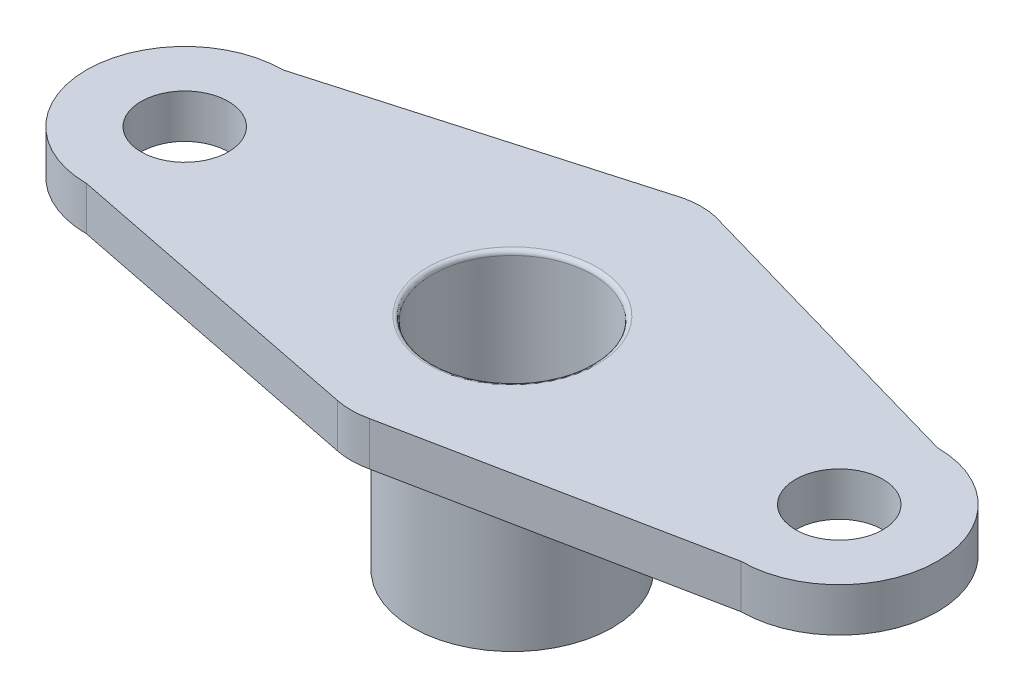
ISO-10303-21;
HEADER;
FILE_DESCRIPTION(('STEP AP214'),'2;1');
FILE_NAME('part.step','',(''),(''),'','','');
FILE_SCHEMA(('AUTOMOTIVE_DESIGN { 1 0 10303 214 1 1 1 1 }'));
ENDSEC;
DATA;
#1=APPLICATION_CONTEXT('core data for automotive mechanical design processes');
#2=APPLICATION_PROTOCOL_DEFINITION('international standard','automotive_design',2000,#1);
#3=PRODUCT_CONTEXT('',#1,'mechanical');
#4=PRODUCT('Part','Part','',(#3));
#5=PRODUCT_RELATED_PRODUCT_CATEGORY('part','',(#4));
#6=PRODUCT_DEFINITION_FORMATION('','',#4);
#7=PRODUCT_DEFINITION_CONTEXT('part definition',#1,'design');
#8=PRODUCT_DEFINITION('design','',#6,#7);
#9=PRODUCT_DEFINITION_SHAPE('','',#8);
#10=(LENGTH_UNIT() NAMED_UNIT(*) SI_UNIT(.MILLI.,.METRE.));
#11=(NAMED_UNIT(*) PLANE_ANGLE_UNIT() SI_UNIT($,.RADIAN.));
#12=(NAMED_UNIT(*) SI_UNIT($,.STERADIAN.) SOLID_ANGLE_UNIT());
#13=UNCERTAINTY_MEASURE_WITH_UNIT(LENGTH_MEASURE(1.E-05),#10,'distance_accuracy_value','');
#14=(GEOMETRIC_REPRESENTATION_CONTEXT(3) GLOBAL_UNCERTAINTY_ASSIGNED_CONTEXT((#13)) GLOBAL_UNIT_ASSIGNED_CONTEXT((#10,
#11,#12)) REPRESENTATION_CONTEXT('',''));
#15=CARTESIAN_POINT('',(0.,0.,0.));
#16=DIRECTION('',(0.,0.,1.));
#17=DIRECTION('',(1.,0.,0.));
#18=AXIS2_PLACEMENT_3D('',#15,#16,#17);
#19=CARTESIAN_POINT('',(-75.,5.,0.));
#20=DIRECTION('',(0.,1.,0.));
#21=DIRECTION('',(0.,0.,1.));
#22=AXIS2_PLACEMENT_3D('',#19,#20,#21);
#23=PLANE('',#22);
#24=CARTESIAN_POINT('',(0.,5.,0.));
#25=DIRECTION('',(0.,1.,0.));
#26=DIRECTION('',(0.,0.,1.));
#27=AXIS2_PLACEMENT_3D('',#24,#25,#26);
#28=CIRCLE('',#27,19.3437615531446);
#29=CARTESIAN_POINT('',(0.,5.,19.3437615531446));
#30=VERTEX_POINT('',#29);
#31=EDGE_CURVE('E11',#30,#30,#28,.F.);
#32=ORIENTED_EDGE('',*,*,#31,.T.);
#33=EDGE_LOOP('',(#32));
#34=FACE_BOUND('',#33,.T.);
#35=CARTESIAN_POINT('',(-75.,5.,0.));
#36=DIRECTION('',(0.,1.,0.));
#37=DIRECTION('',(0.,0.,1.));
#38=AXIS2_PLACEMENT_3D('',#35,#36,#37);
#39=CIRCLE('',#38,9.99999999999999);
#40=CARTESIAN_POINT('',(-75.,5.,9.99999999999999));
#41=VERTEX_POINT('',#40);
#42=EDGE_CURVE('E143',#41,#41,#39,.T.);
#43=ORIENTED_EDGE('',*,*,#42,.F.);
#44=EDGE_LOOP('',(#43));
#45=FACE_BOUND('',#44,.T.);
#46=CARTESIAN_POINT('',(-75.,5.,0.));
#47=DIRECTION('',(0.,1.,0.));
#48=DIRECTION('',(0.,0.,1.));
#49=AXIS2_PLACEMENT_3D('',#46,#47,#48);
#50=CIRCLE('',#49,22.5);
#51=CARTESIAN_POINT('',(-75.,5.,-22.5));
#52=VERTEX_POINT('',#51);
#53=CARTESIAN_POINT('',(-75.,5.,22.5));
#54=VERTEX_POINT('',#53);
#55=EDGE_CURVE('E155',#52,#54,#50,.T.);
#56=ORIENTED_EDGE('',*,*,#55,.T.);
#57=DIRECTION('',(0.9807029114669,0.,0.195503962722871));
#58=VECTOR('',#57,1.);
#59=CARTESIAN_POINT('',(-75.,5.,22.5));
#60=LINE('',#59,#58);
#61=CARTESIAN_POINT('',(-3.19997264006877,5.,36.8133967569045));
#62=VERTEX_POINT('',#61);
#63=EDGE_CURVE('E99',#54,#62,#60,.T.);
#64=ORIENTED_EDGE('',*,*,#63,.T.);
#65=CARTESIAN_POINT('',(0.207378380876347,5.,20.0427553689834));
#66=DIRECTION('',(0.,1.,0.));
#67=DIRECTION('',(0.,0.,1.));
#68=AXIS2_PLACEMENT_3D('',#65,#66,#67);
#69=CIRCLE('',#68,17.1132829562941);
#70=CARTESIAN_POINT('',(4.04334236130269,5.,36.7205799838143));
#71=VERTEX_POINT('',#70);
#72=EDGE_CURVE('E192',#62,#71,#69,.T.);
#73=ORIENTED_EDGE('',*,*,#72,.T.);
#74=DIRECTION('',(0.980408150528872,0.,-0.196976796543542));
#75=VECTOR('',#74,1.);
#76=CARTESIAN_POINT('',(4.04334236130269,5.,36.7205799838143));
#77=LINE('',#76,#75);
#78=CARTESIAN_POINT('',(74.8231132075472,5.,22.5));
#79=VERTEX_POINT('',#78);
#80=EDGE_CURVE('E194',#71,#79,#77,.T.);
#81=ORIENTED_EDGE('',*,*,#80,.T.);
#82=CARTESIAN_POINT('',(74.8231132075472,5.,0.));
#83=DIRECTION('',(0.,1.,0.));
#84=DIRECTION('',(0.,0.,-1.));
#85=AXIS2_PLACEMENT_3D('',#82,#83,#84);
#86=CIRCLE('',#85,22.5);
#87=CARTESIAN_POINT('',(74.8231132075472,5.,-22.5));
#88=VERTEX_POINT('',#87);
#89=EDGE_CURVE('E118',#79,#88,#86,.T.);
#90=ORIENTED_EDGE('',*,*,#89,.T.);
#91=DIRECTION('',(-0.9613987393649,0.,-0.275158979405691));
#92=VECTOR('',#91,1.);
#93=CARTESIAN_POINT('',(74.8231132075472,5.,-22.5));
#94=LINE('',#93,#92);
#95=CARTESIAN_POINT('',(3.53773584905662,5.,-42.9023688375849));
#96=VERTEX_POINT('',#95);
#97=EDGE_CURVE('E114',#88,#96,#94,.T.);
#98=ORIENTED_EDGE('',*,*,#97,.T.);
#99=CARTESIAN_POINT('',(-0.0884433962264064,5.,-26.1776781790625));
#100=DIRECTION('',(0.,1.,0.));
#101=DIRECTION('',(0.,0.,-1.));
#102=AXIS2_PLACEMENT_3D('',#99,#100,#101);
#103=CIRCLE('',#102,17.1132829562941);
#104=CARTESIAN_POINT('',(-3.71462264150943,5.,-42.9023688375849));
#105=VERTEX_POINT('',#104);
#106=EDGE_CURVE('E116',#96,#105,#103,.T.);
#107=ORIENTED_EDGE('',*,*,#106,.T.);
#108=DIRECTION('',(-0.9613987393649,0.,0.275158979405691));
#109=VECTOR('',#108,1.);
#110=CARTESIAN_POINT('',(-75.,5.,-22.5));
#111=LINE('',#110,#109);
#112=EDGE_CURVE('E57',#105,#52,#111,.T.);
#113=ORIENTED_EDGE('',*,*,#112,.T.);
#114=EDGE_LOOP('',(#56,#64,#73,#81,#90,#98,#107,#113));
#115=FACE_BOUND('',#114,.T.);
#116=CARTESIAN_POINT('',(74.8231132075472,5.,0.));
#117=DIRECTION('',(0.,1.,0.));
#118=DIRECTION('',(0.,0.,-1.));
#119=AXIS2_PLACEMENT_3D('',#116,#117,#118);
#120=CIRCLE('',#119,9.99999999999999);
#121=CARTESIAN_POINT('',(74.8231132075472,5.,-9.99999999999999));
#122=VERTEX_POINT('',#121);
#123=EDGE_CURVE('E179',#122,#122,#120,.T.);
#124=ORIENTED_EDGE('',*,*,#123,.F.);
#125=EDGE_LOOP('',(#124));
#126=FACE_BOUND('',#125,.T.);
#127=ADVANCED_FACE('F39',(#34,#45,#115,#126),#23,.T.);
#128=CARTESIAN_POINT('',(-75.,-5.,0.));
#129=DIRECTION('',(0.,1.,0.));
#130=DIRECTION('',(0.,0.,1.));
#131=AXIS2_PLACEMENT_3D('',#128,#129,#130);
#132=PLANE('',#131);
#133=CARTESIAN_POINT('',(0.,-5.,0.));
#134=DIRECTION('',(0.,-1.,0.));
#135=DIRECTION('',(0.,0.,-1.));
#136=AXIS2_PLACEMENT_3D('',#133,#134,#135);
#137=CIRCLE('',#136,22.8896787294271);
#138=CARTESIAN_POINT('',(0.,-5.,-22.8896787294271));
#139=VERTEX_POINT('',#138);
#140=EDGE_CURVE('E167',#139,#139,#137,.T.);
#141=ORIENTED_EDGE('',*,*,#140,.F.);
#142=EDGE_LOOP('',(#141));
#143=FACE_BOUND('',#142,.T.);
#144=CARTESIAN_POINT('',(-75.,-5.,0.));
#145=DIRECTION('',(0.,1.,0.));
#146=DIRECTION('',(0.,0.,1.));
#147=AXIS2_PLACEMENT_3D('',#144,#145,#146);
#148=CIRCLE('',#147,22.5);
#149=CARTESIAN_POINT('',(-75.,-5.,-22.5));
#150=VERTEX_POINT('',#149);
#151=CARTESIAN_POINT('',(-75.,-5.,22.5));
#152=VERTEX_POINT('',#151);
#153=EDGE_CURVE('E140',#150,#152,#148,.T.);
#154=ORIENTED_EDGE('',*,*,#153,.F.);
#155=DIRECTION('',(-0.9613987393649,0.,0.275158979405691));
#156=VECTOR('',#155,1.);
#157=CARTESIAN_POINT('',(-75.,-5.,-22.5));
#158=LINE('',#157,#156);
#159=CARTESIAN_POINT('',(-3.71462264150943,-5.,-42.9023688375849));
#160=VERTEX_POINT('',#159);
#161=EDGE_CURVE('E93',#160,#150,#158,.T.);
#162=ORIENTED_EDGE('',*,*,#161,.F.);
#163=CARTESIAN_POINT('',(-0.0884433962264064,-5.,-26.1776781790625));
#164=DIRECTION('',(0.,1.,0.));
#165=DIRECTION('',(0.,0.,-1.));
#166=AXIS2_PLACEMENT_3D('',#163,#164,#165);
#167=CIRCLE('',#166,17.1132829562941);
#168=CARTESIAN_POINT('',(3.53773584905662,-5.,-42.9023688375849));
#169=VERTEX_POINT('',#168);
#170=EDGE_CURVE('E83',#169,#160,#167,.T.);
#171=ORIENTED_EDGE('',*,*,#170,.F.);
#172=DIRECTION('',(-0.9613987393649,0.,-0.275158979405691));
#173=VECTOR('',#172,1.);
#174=CARTESIAN_POINT('',(74.8231132075472,-5.,-22.5));
#175=LINE('',#174,#173);
#176=CARTESIAN_POINT('',(74.8231132075472,-5.,-22.5));
#177=VERTEX_POINT('',#176);
#178=EDGE_CURVE('E130',#177,#169,#175,.T.);
#179=ORIENTED_EDGE('',*,*,#178,.F.);
#180=CARTESIAN_POINT('',(74.8231132075472,-5.,0.));
#181=DIRECTION('',(0.,1.,0.));
#182=DIRECTION('',(0.,0.,-1.));
#183=AXIS2_PLACEMENT_3D('',#180,#181,#182);
#184=CIRCLE('',#183,22.5);
#185=CARTESIAN_POINT('',(74.8231132075472,-5.,22.5));
#186=VERTEX_POINT('',#185);
#187=EDGE_CURVE('E150',#186,#177,#184,.T.);
#188=ORIENTED_EDGE('',*,*,#187,.F.);
#189=DIRECTION('',(0.980408150528872,0.,-0.196976796543542));
#190=VECTOR('',#189,1.);
#191=CARTESIAN_POINT('',(4.04334236130269,-5.,36.7205799838143));
#192=LINE('',#191,#190);
#193=CARTESIAN_POINT('',(4.04334236130269,-5.,36.7205799838143));
#194=VERTEX_POINT('',#193);
#195=EDGE_CURVE('E144',#194,#186,#192,.T.);
#196=ORIENTED_EDGE('',*,*,#195,.F.);
#197=CARTESIAN_POINT('',(0.207378380876347,-5.,20.0427553689834));
#198=DIRECTION('',(0.,1.,0.));
#199=DIRECTION('',(0.,0.,1.));
#200=AXIS2_PLACEMENT_3D('',#197,#198,#199);
#201=CIRCLE('',#200,17.1132829562941);
#202=CARTESIAN_POINT('',(-3.19997264006877,-5.,36.8133967569045));
#203=VERTEX_POINT('',#202);
#204=EDGE_CURVE('E141',#203,#194,#201,.T.);
#205=ORIENTED_EDGE('',*,*,#204,.F.);
#206=DIRECTION('',(0.9807029114669,0.,0.195503962722871));
#207=VECTOR('',#206,1.);
#208=CARTESIAN_POINT('',(-75.,-5.,22.5));
#209=LINE('',#208,#207);
#210=EDGE_CURVE('E138',#152,#203,#209,.T.);
#211=ORIENTED_EDGE('',*,*,#210,.F.);
#212=EDGE_LOOP('',(#154,#162,#171,#179,#188,#196,#205,#211));
#213=FACE_BOUND('',#212,.T.);
#214=CARTESIAN_POINT('',(-75.,-5.,0.));
#215=DIRECTION('',(0.,1.,0.));
#216=DIRECTION('',(0.,0.,1.));
#217=AXIS2_PLACEMENT_3D('',#214,#215,#216);
#218=CIRCLE('',#217,9.99999999999999);
#219=CARTESIAN_POINT('',(-75.,-5.,9.99999999999999));
#220=VERTEX_POINT('',#219);
#221=EDGE_CURVE('E182',#220,#220,#218,.T.);
#222=ORIENTED_EDGE('',*,*,#221,.T.);
#223=EDGE_LOOP('',(#222));
#224=FACE_BOUND('',#223,.T.);
#225=CARTESIAN_POINT('',(74.8231132075472,-5.,0.));
#226=DIRECTION('',(0.,1.,0.));
#227=DIRECTION('',(0.,0.,-1.));
#228=AXIS2_PLACEMENT_3D('',#225,#226,#227);
#229=CIRCLE('',#228,9.99999999999999);
#230=CARTESIAN_POINT('',(74.8231132075472,-5.,-9.99999999999999));
#231=VERTEX_POINT('',#230);
#232=EDGE_CURVE('E185',#231,#231,#229,.T.);
#233=ORIENTED_EDGE('',*,*,#232,.T.);
#234=EDGE_LOOP('',(#233));
#235=FACE_BOUND('',#234,.T.);
#236=ADVANCED_FACE('F206',(#143,#213,#224,#235),#132,.F.);
#237=CARTESIAN_POINT('',(-75.,5.,0.));
#238=DIRECTION('',(0.,-1.,0.));
#239=DIRECTION('',(0.,0.,-1.));
#240=AXIS2_PLACEMENT_3D('',#237,#238,#239);
#241=CYLINDRICAL_SURFACE('',#240,22.5);
#242=ORIENTED_EDGE('',*,*,#153,.T.);
#243=DIRECTION('',(0.,-1.,0.));
#244=VECTOR('',#243,1.);
#245=CARTESIAN_POINT('',(-75.,5.,22.5));
#246=LINE('',#245,#244);
#247=EDGE_CURVE('E164',#54,#152,#246,.T.);
#248=ORIENTED_EDGE('',*,*,#247,.F.);
#249=ORIENTED_EDGE('',*,*,#55,.F.);
#250=DIRECTION('',(0.,-1.,0.));
#251=VECTOR('',#250,1.);
#252=CARTESIAN_POINT('',(-75.,5.,-22.5));
#253=LINE('',#252,#251);
#254=EDGE_CURVE('E135',#52,#150,#253,.T.);
#255=ORIENTED_EDGE('',*,*,#254,.T.);
#256=EDGE_LOOP('',(#242,#248,#249,#255));
#257=FACE_BOUND('',#256,.T.);
#258=ADVANCED_FACE('F211',(#257),#241,.T.);
#259=CARTESIAN_POINT('',(-75.,5.,22.5));
#260=DIRECTION('',(0.195503962722871,0.,-0.9807029114669));
#261=DIRECTION('',(-0.9807029114669,0.,-0.195503962722871));
#262=AXIS2_PLACEMENT_3D('',#259,#260,#261);
#263=PLANE('',#262);
#264=ORIENTED_EDGE('',*,*,#210,.T.);
#265=DIRECTION('',(0.,-1.,0.));
#266=VECTOR('',#265,1.);
#267=CARTESIAN_POINT('',(-3.19997264006877,5.,36.8133967569045));
#268=LINE('',#267,#266);
#269=EDGE_CURVE('E165',#62,#203,#268,.T.);
#270=ORIENTED_EDGE('',*,*,#269,.F.);
#271=ORIENTED_EDGE('',*,*,#63,.F.);
#272=ORIENTED_EDGE('',*,*,#247,.T.);
#273=EDGE_LOOP('',(#264,#270,#271,#272));
#274=FACE_BOUND('',#273,.T.);
#275=ADVANCED_FACE('F339',(#274),#263,.F.);
#276=CARTESIAN_POINT('',(0.207378380876347,5.,20.0427553689834));
#277=DIRECTION('',(0.,-1.,0.));
#278=DIRECTION('',(0.,0.,-1.));
#279=AXIS2_PLACEMENT_3D('',#276,#277,#278);
#280=CYLINDRICAL_SURFACE('',#279,17.1132829562941);
#281=ORIENTED_EDGE('',*,*,#204,.T.);
#282=DIRECTION('',(0.,-1.,0.));
#283=VECTOR('',#282,1.);
#284=CARTESIAN_POINT('',(4.04334236130269,5.,36.7205799838143));
#285=LINE('',#284,#283);
#286=EDGE_CURVE('E157',#71,#194,#285,.T.);
#287=ORIENTED_EDGE('',*,*,#286,.F.);
#288=ORIENTED_EDGE('',*,*,#72,.F.);
#289=ORIENTED_EDGE('',*,*,#269,.T.);
#290=EDGE_LOOP('',(#281,#287,#288,#289));
#291=FACE_BOUND('',#290,.T.);
#292=ADVANCED_FACE('F330',(#291),#280,.T.);
#293=CARTESIAN_POINT('',(4.04334236130269,5.,36.7205799838143));
#294=DIRECTION('',(-0.196976796543542,0.,-0.980408150528872));
#295=DIRECTION('',(-0.980408150528872,0.,0.196976796543542));
#296=AXIS2_PLACEMENT_3D('',#293,#294,#295);
#297=PLANE('',#296);
#298=ORIENTED_EDGE('',*,*,#195,.T.);
#299=DIRECTION('',(0.,-1.,0.));
#300=VECTOR('',#299,1.);
#301=CARTESIAN_POINT('',(74.8231132075472,5.,22.5));
#302=LINE('',#301,#300);
#303=EDGE_CURVE('E156',#79,#186,#302,.T.);
#304=ORIENTED_EDGE('',*,*,#303,.F.);
#305=ORIENTED_EDGE('',*,*,#80,.F.);
#306=ORIENTED_EDGE('',*,*,#286,.T.);
#307=EDGE_LOOP('',(#298,#304,#305,#306));
#308=FACE_BOUND('',#307,.T.);
#309=ADVANCED_FACE('F200',(#308),#297,.F.);
#310=CARTESIAN_POINT('',(74.8231132075472,5.,0.));
#311=DIRECTION('',(0.,-1.,0.));
#312=DIRECTION('',(0.,0.,-1.));
#313=AXIS2_PLACEMENT_3D('',#310,#311,#312);
#314=CYLINDRICAL_SURFACE('',#313,22.5);
#315=ORIENTED_EDGE('',*,*,#187,.T.);
#316=DIRECTION('',(0.,-1.,0.));
#317=VECTOR('',#316,1.);
#318=CARTESIAN_POINT('',(74.8231132075472,5.,-22.5));
#319=LINE('',#318,#317);
#320=EDGE_CURVE('E126',#88,#177,#319,.T.);
#321=ORIENTED_EDGE('',*,*,#320,.F.);
#322=ORIENTED_EDGE('',*,*,#89,.F.);
#323=ORIENTED_EDGE('',*,*,#303,.T.);
#324=EDGE_LOOP('',(#315,#321,#322,#323));
#325=FACE_BOUND('',#324,.T.);
#326=ADVANCED_FACE('F201',(#325),#314,.T.);
#327=CARTESIAN_POINT('',(74.8231132075472,5.,-22.5));
#328=DIRECTION('',(-0.275158979405691,0.,0.9613987393649));
#329=DIRECTION('',(0.9613987393649,0.,0.275158979405691));
#330=AXIS2_PLACEMENT_3D('',#327,#328,#329);
#331=PLANE('',#330);
#332=ORIENTED_EDGE('',*,*,#178,.T.);
#333=DIRECTION('',(0.,-1.,0.));
#334=VECTOR('',#333,1.);
#335=CARTESIAN_POINT('',(3.53773584905662,5.,-42.9023688375849));
#336=LINE('',#335,#334);
#337=EDGE_CURVE('E121',#96,#169,#336,.T.);
#338=ORIENTED_EDGE('',*,*,#337,.F.);
#339=ORIENTED_EDGE('',*,*,#97,.F.);
#340=ORIENTED_EDGE('',*,*,#320,.T.);
#341=EDGE_LOOP('',(#332,#338,#339,#340));
#342=FACE_BOUND('',#341,.T.);
#343=ADVANCED_FACE('F123',(#342),#331,.F.);
#344=CARTESIAN_POINT('',(-0.0884433962264064,5.,-26.1776781790625));
#345=DIRECTION('',(0.,-1.,0.));
#346=DIRECTION('',(0.,0.,-1.));
#347=AXIS2_PLACEMENT_3D('',#344,#345,#346);
#348=CYLINDRICAL_SURFACE('',#347,17.1132829562941);
#349=ORIENTED_EDGE('',*,*,#170,.T.);
#350=DIRECTION('',(0.,-1.,0.));
#351=VECTOR('',#350,1.);
#352=CARTESIAN_POINT('',(-3.71462264150943,5.,-42.9023688375849));
#353=LINE('',#352,#351);
#354=EDGE_CURVE('E129',#105,#160,#353,.T.);
#355=ORIENTED_EDGE('',*,*,#354,.F.);
#356=ORIENTED_EDGE('',*,*,#106,.F.);
#357=ORIENTED_EDGE('',*,*,#337,.T.);
#358=EDGE_LOOP('',(#349,#355,#356,#357));
#359=FACE_BOUND('',#358,.T.);
#360=ADVANCED_FACE('F134',(#359),#348,.T.);
#361=CARTESIAN_POINT('',(-75.,5.,-22.5));
#362=DIRECTION('',(0.275158979405691,0.,0.9613987393649));
#363=DIRECTION('',(0.9613987393649,0.,-0.275158979405691));
#364=AXIS2_PLACEMENT_3D('',#361,#362,#363);
#365=PLANE('',#364);
#366=ORIENTED_EDGE('',*,*,#161,.T.);
#367=ORIENTED_EDGE('',*,*,#254,.F.);
#368=ORIENTED_EDGE('',*,*,#112,.F.);
#369=ORIENTED_EDGE('',*,*,#354,.T.);
#370=EDGE_LOOP('',(#366,#367,#368,#369));
#371=FACE_BOUND('',#370,.T.);
#372=ADVANCED_FACE('F213',(#371),#365,.F.);
#373=CARTESIAN_POINT('',(-75.,5.,0.));
#374=DIRECTION('',(0.,-1.,0.));
#375=DIRECTION('',(0.,0.,-1.));
#376=AXIS2_PLACEMENT_3D('',#373,#374,#375);
#377=CYLINDRICAL_SURFACE('',#376,9.99999999999999);
#378=ORIENTED_EDGE('',*,*,#42,.T.);
#379=EDGE_LOOP('',(#378));
#380=FACE_BOUND('',#379,.T.);
#381=ORIENTED_EDGE('',*,*,#221,.F.);
#382=EDGE_LOOP('',(#381));
#383=FACE_BOUND('',#382,.T.);
#384=ADVANCED_FACE('F214',(#380,#383),#377,.F.);
#385=CARTESIAN_POINT('',(74.8231132075472,5.,0.));
#386=DIRECTION('',(0.,-1.,0.));
#387=DIRECTION('',(0.,0.,-1.));
#388=AXIS2_PLACEMENT_3D('',#385,#386,#387);
#389=CYLINDRICAL_SURFACE('',#388,9.99999999999999);
#390=ORIENTED_EDGE('',*,*,#123,.T.);
#391=EDGE_LOOP('',(#390));
#392=FACE_BOUND('',#391,.T.);
#393=ORIENTED_EDGE('',*,*,#232,.F.);
#394=EDGE_LOOP('',(#393));
#395=FACE_BOUND('',#394,.T.);
#396=ADVANCED_FACE('F222',(#392,#395),#389,.F.);
#397=CARTESIAN_POINT('',(0.,-45.386280801784,0.));
#398=DIRECTION('',(0.,-1.,0.));
#399=DIRECTION('',(0.,0.,-1.));
#400=AXIS2_PLACEMENT_3D('',#397,#398,#399);
#401=PLANE('',#400);
#402=CARTESIAN_POINT('',(0.,-45.386280801784,0.));
#403=DIRECTION('',(0.,-1.,0.));
#404=DIRECTION('',(0.,0.,-1.));
#405=AXIS2_PLACEMENT_3D('',#402,#403,#404);
#406=CIRCLE('',#405,18.3437615531446);
#407=CARTESIAN_POINT('',(0.,-45.386280801784,-18.3437615531446));
#408=VERTEX_POINT('',#407);
#409=EDGE_CURVE('E254',#408,#408,#406,.T.);
#410=ORIENTED_EDGE('',*,*,#409,.F.);
#411=EDGE_LOOP('',(#410));
#412=FACE_BOUND('',#411,.T.);
#413=CARTESIAN_POINT('',(0.,-45.386280801784,0.));
#414=DIRECTION('',(0.,-1.,0.));
#415=DIRECTION('',(0.,0.,-1.));
#416=AXIS2_PLACEMENT_3D('',#413,#414,#415);
#417=CIRCLE('',#416,22.8896787294271);
#418=CARTESIAN_POINT('',(0.,-45.386280801784,-22.8896787294271));
#419=VERTEX_POINT('',#418);
#420=EDGE_CURVE('E177',#419,#419,#417,.T.);
#421=ORIENTED_EDGE('',*,*,#420,.T.);
#422=EDGE_LOOP('',(#421));
#423=FACE_BOUND('',#422,.T.);
#424=ADVANCED_FACE('F239',(#412,#423),#401,.T.);
#425=CARTESIAN_POINT('',(0.,-45.386280801784,0.));
#426=DIRECTION('',(0.,1.,0.));
#427=DIRECTION('',(0.,0.,1.));
#428=AXIS2_PLACEMENT_3D('',#425,#426,#427);
#429=CYLINDRICAL_SURFACE('',#428,22.8896787294271);
#430=ORIENTED_EDGE('',*,*,#420,.F.);
#431=EDGE_LOOP('',(#430));
#432=FACE_BOUND('',#431,.T.);
#433=ORIENTED_EDGE('',*,*,#140,.T.);
#434=EDGE_LOOP('',(#433));
#435=FACE_BOUND('',#434,.T.);
#436=ADVANCED_FACE('F244',(#432,#435),#429,.T.);
#437=CARTESIAN_POINT('',(0.,14.613719198216,0.));
#438=DIRECTION('',(0.,-1.,0.));
#439=DIRECTION('',(0.,0.,-1.));
#440=AXIS2_PLACEMENT_3D('',#437,#438,#439);
#441=CYLINDRICAL_SURFACE('',#440,18.3437615531446);
#442=CARTESIAN_POINT('',(0.,4.,0.));
#443=DIRECTION('',(0.,1.,0.));
#444=DIRECTION('',(0.,0.,1.));
#445=AXIS2_PLACEMENT_3D('',#442,#443,#444);
#446=CIRCLE('',#445,18.3437615531446);
#447=CARTESIAN_POINT('',(0.,4.,18.3437615531446));
#448=VERTEX_POINT('',#447);
#449=EDGE_CURVE('E48',#448,#448,#446,.T.);
#450=ORIENTED_EDGE('',*,*,#449,.T.);
#451=EDGE_LOOP('',(#450));
#452=FACE_BOUND('',#451,.T.);
#453=ORIENTED_EDGE('',*,*,#409,.T.);
#454=EDGE_LOOP('',(#453));
#455=FACE_BOUND('',#454,.T.);
#456=ADVANCED_FACE('F243',(#452,#455),#441,.F.);
#457=CARTESIAN_POINT('',(0.,4.,0.));
#458=DIRECTION('',(0.,1.,0.));
#459=DIRECTION('',(0.,0.,1.));
#460=AXIS2_PLACEMENT_3D('',#457,#458,#459);
#461=TOROIDAL_SURFACE('',#460,19.3437615531446,1.);
#462=ORIENTED_EDGE('',*,*,#31,.F.);
#463=EDGE_LOOP('',(#462));
#464=FACE_BOUND('',#463,.T.);
#465=ORIENTED_EDGE('',*,*,#449,.F.);
#466=EDGE_LOOP('',(#465));
#467=FACE_BOUND('',#466,.T.);
#468=ADVANCED_FACE('F41',(#464,#467),#461,.T.);
#469=CLOSED_SHELL('',(#127,#236,#258,#275,#292,#309,#326,#343,#360,#372,#384,#396,#424,#436,
#456,#468));
#470=MANIFOLD_SOLID_BREP('B2',#469);
#471=ADVANCED_BREP_SHAPE_REPRESENTATION('',(#18,#470),#14);
#472=SHAPE_DEFINITION_REPRESENTATION(#9,#471);
ENDSEC;
END-ISO-10303-21;
